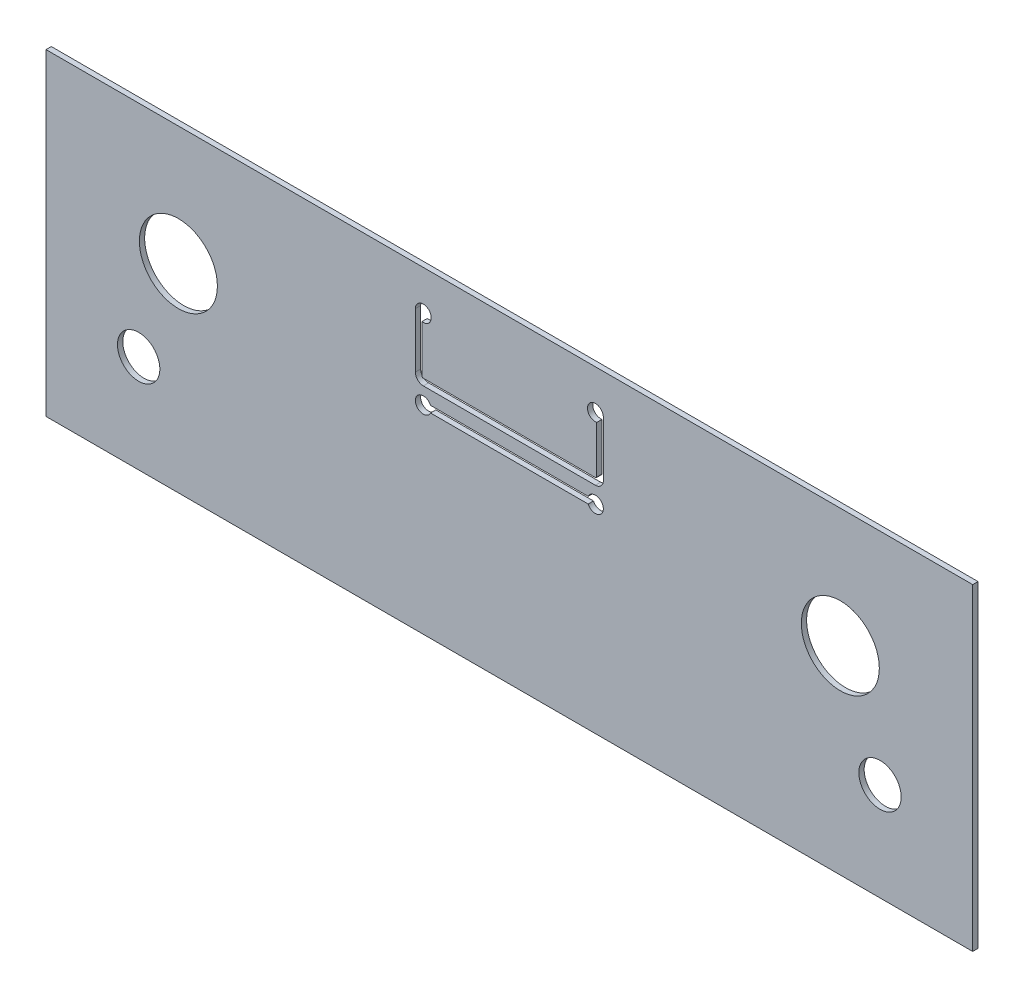
ISO-10303-21;
HEADER;
FILE_DESCRIPTION(('STEP AP214'),'2;1');
FILE_NAME('part.step','',(''),(''),'','','');
FILE_SCHEMA(('AUTOMOTIVE_DESIGN { 1 0 10303 214 1 1 1 1 }'));
ENDSEC;
DATA;
#1=APPLICATION_CONTEXT('core data for automotive mechanical design processes');
#2=APPLICATION_PROTOCOL_DEFINITION('international standard','automotive_design',2000,#1);
#3=PRODUCT_CONTEXT('',#1,'mechanical');
#4=PRODUCT('Part','Part','',(#3));
#5=PRODUCT_RELATED_PRODUCT_CATEGORY('part','',(#4));
#6=PRODUCT_DEFINITION_FORMATION('','',#4);
#7=PRODUCT_DEFINITION_CONTEXT('part definition',#1,'design');
#8=PRODUCT_DEFINITION('design','',#6,#7);
#9=PRODUCT_DEFINITION_SHAPE('','',#8);
#10=(LENGTH_UNIT() NAMED_UNIT(*) SI_UNIT(.MILLI.,.METRE.));
#11=(NAMED_UNIT(*) PLANE_ANGLE_UNIT() SI_UNIT($,.RADIAN.));
#12=(NAMED_UNIT(*) SI_UNIT($,.STERADIAN.) SOLID_ANGLE_UNIT());
#13=UNCERTAINTY_MEASURE_WITH_UNIT(LENGTH_MEASURE(1.E-05),#10,'distance_accuracy_value','');
#14=(GEOMETRIC_REPRESENTATION_CONTEXT(3) GLOBAL_UNCERTAINTY_ASSIGNED_CONTEXT((#13)) GLOBAL_UNIT_ASSIGNED_CONTEXT((#10,
#11,#12)) REPRESENTATION_CONTEXT('',''));
#15=CARTESIAN_POINT('',(0.,0.,0.));
#16=DIRECTION('',(0.,0.,1.));
#17=DIRECTION('',(1.,0.,0.));
#18=AXIS2_PLACEMENT_3D('',#15,#16,#17);
#19=CARTESIAN_POINT('',(0.,0.,0.2));
#20=DIRECTION('',(0.,0.,-1.));
#21=DIRECTION('',(-1.,0.,0.));
#22=AXIS2_PLACEMENT_3D('',#19,#20,#21);
#23=PLANE('',#22);
#24=CARTESIAN_POINT('',(30.,-4.5,0.2));
#25=DIRECTION('',(0.,0.,1.));
#26=DIRECTION('',(1.,0.,0.));
#27=AXIS2_PLACEMENT_3D('',#24,#25,#26);
#28=CIRCLE('',#27,1.4732);
#29=CARTESIAN_POINT('',(31.4732,-4.5,0.2));
#30=VERTEX_POINT('',#29);
#31=EDGE_CURVE('E218',#30,#30,#28,.T.);
#32=ORIENTED_EDGE('',*,*,#31,.F.);
#33=EDGE_LOOP('',(#32));
#34=FACE_BOUND('',#33,.T.);
#35=CARTESIAN_POINT('',(14.25,-4.5,0.2));
#36=DIRECTION('',(0.,0.,1.));
#37=DIRECTION('',(1.,0.,0.));
#38=AXIS2_PLACEMENT_3D('',#35,#36,#37);
#39=CIRCLE('',#38,0.3);
#40=CARTESIAN_POINT('',(14.5227178028659,-4.375,0.2));
#41=VERTEX_POINT('',#40);
#42=CARTESIAN_POINT('',(14.5227178028659,-4.625,0.2));
#43=VERTEX_POINT('',#42);
#44=EDGE_CURVE('E268',#41,#43,#39,.T.);
#45=ORIENTED_EDGE('',*,*,#44,.F.);
#46=DIRECTION('',(-1.,0.,0.));
#47=VECTOR('',#46,1.);
#48=CARTESIAN_POINT('',(20.4772821971341,-4.375,0.2));
#49=LINE('',#48,#47);
#50=CARTESIAN_POINT('',(20.4772821971341,-4.375,0.2));
#51=VERTEX_POINT('',#50);
#52=EDGE_CURVE('E276',#51,#41,#49,.T.);
#53=ORIENTED_EDGE('',*,*,#52,.F.);
#54=CARTESIAN_POINT('',(20.75,-4.5,0.2));
#55=DIRECTION('',(0.,0.,1.));
#56=DIRECTION('',(1.,0.,0.));
#57=AXIS2_PLACEMENT_3D('',#54,#55,#56);
#58=CIRCLE('',#57,0.3);
#59=CARTESIAN_POINT('',(20.4772821971341,-4.625,0.2));
#60=VERTEX_POINT('',#59);
#61=EDGE_CURVE('E273',#60,#51,#58,.T.);
#62=ORIENTED_EDGE('',*,*,#61,.F.);
#63=DIRECTION('',(1.,0.,0.));
#64=VECTOR('',#63,1.);
#65=CARTESIAN_POINT('',(14.5227178028659,-4.625,0.2));
#66=LINE('',#65,#64);
#67=EDGE_CURVE('E270',#43,#60,#66,.T.);
#68=ORIENTED_EDGE('',*,*,#67,.F.);
#69=EDGE_LOOP('',(#45,#53,#62,#68));
#70=FACE_BOUND('',#69,.T.);
#71=CARTESIAN_POINT('',(3.5,-8.3,0.2));
#72=DIRECTION('',(0.,0.,1.));
#73=DIRECTION('',(1.,0.,0.));
#74=AXIS2_PLACEMENT_3D('',#71,#72,#73);
#75=CIRCLE('',#74,0.800099999999999);
#76=CARTESIAN_POINT('',(4.3001,-8.3,0.2));
#77=VERTEX_POINT('',#76);
#78=EDGE_CURVE('E305',#77,#77,#75,.T.);
#79=ORIENTED_EDGE('',*,*,#78,.F.);
#80=EDGE_LOOP('',(#79));
#81=FACE_BOUND('',#80,.T.);
#82=DIRECTION('',(0.,-1.,0.));
#83=VECTOR('',#82,1.);
#84=CARTESIAN_POINT('',(0.,-12.,0.2));
#85=LINE('',#84,#83);
#86=CARTESIAN_POINT('',(0.,0.,0.2));
#87=VERTEX_POINT('',#86);
#88=CARTESIAN_POINT('',(0.,-12.,0.2));
#89=VERTEX_POINT('',#88);
#90=EDGE_CURVE('E311',#87,#89,#85,.T.);
#91=ORIENTED_EDGE('',*,*,#90,.T.);
#92=DIRECTION('',(1.,0.,0.));
#93=VECTOR('',#92,1.);
#94=CARTESIAN_POINT('',(35.,-12.,0.2));
#95=LINE('',#94,#93);
#96=CARTESIAN_POINT('',(35.,-12.,0.2));
#97=VERTEX_POINT('',#96);
#98=EDGE_CURVE('E314',#89,#97,#95,.T.);
#99=ORIENTED_EDGE('',*,*,#98,.T.);
#100=DIRECTION('',(0.,1.,0.));
#101=VECTOR('',#100,1.);
#102=CARTESIAN_POINT('',(35.,0.,0.2));
#103=LINE('',#102,#101);
#104=CARTESIAN_POINT('',(35.,0.,0.2));
#105=VERTEX_POINT('',#104);
#106=EDGE_CURVE('E317',#97,#105,#103,.T.);
#107=ORIENTED_EDGE('',*,*,#106,.T.);
#108=DIRECTION('',(-1.,0.,0.));
#109=VECTOR('',#108,1.);
#110=CARTESIAN_POINT('',(0.,0.,0.2));
#111=LINE('',#110,#109);
#112=EDGE_CURVE('E319',#105,#87,#111,.T.);
#113=ORIENTED_EDGE('',*,*,#112,.T.);
#114=EDGE_LOOP('',(#91,#99,#107,#113));
#115=FACE_BOUND('',#114,.T.);
#116=CARTESIAN_POINT('',(5.,-4.5,0.2));
#117=DIRECTION('',(0.,0.,1.));
#118=DIRECTION('',(1.,0.,0.));
#119=AXIS2_PLACEMENT_3D('',#116,#117,#118);
#120=CIRCLE('',#119,1.4732);
#121=CARTESIAN_POINT('',(6.4732,-4.5,0.2));
#122=VERTEX_POINT('',#121);
#123=EDGE_CURVE('E299',#122,#122,#120,.T.);
#124=ORIENTED_EDGE('',*,*,#123,.F.);
#125=EDGE_LOOP('',(#124));
#126=FACE_BOUND('',#125,.T.);
#127=CARTESIAN_POINT('',(14.25,-3.575,0.2));
#128=DIRECTION('',(0.,0.,-1.));
#129=DIRECTION('',(1.,0.,0.));
#130=AXIS2_PLACEMENT_3D('',#127,#128,#129);
#131=CIRCLE('',#130,0.0499999999999986);
#132=CARTESIAN_POINT('',(14.25,-3.625,0.2));
#133=VERTEX_POINT('',#132);
#134=CARTESIAN_POINT('',(14.2,-3.575,0.2));
#135=VERTEX_POINT('',#134);
#136=EDGE_CURVE('E172',#133,#135,#131,.T.);
#137=ORIENTED_EDGE('',*,*,#136,.F.);
#138=DIRECTION('',(-1.,0.,0.));
#139=VECTOR('',#138,1.);
#140=CARTESIAN_POINT('',(14.25,-3.625,0.2));
#141=LINE('',#140,#139);
#142=CARTESIAN_POINT('',(20.75,-3.625,0.2));
#143=VERTEX_POINT('',#142);
#144=EDGE_CURVE('E215',#143,#133,#141,.T.);
#145=ORIENTED_EDGE('',*,*,#144,.F.);
#146=CARTESIAN_POINT('',(20.75,-3.575,0.2));
#147=DIRECTION('',(0.,0.,-1.));
#148=DIRECTION('',(1.,0.,0.));
#149=AXIS2_PLACEMENT_3D('',#146,#147,#148);
#150=CIRCLE('',#149,0.0499999999999969);
#151=CARTESIAN_POINT('',(20.8,-3.575,0.2));
#152=VERTEX_POINT('',#151);
#153=EDGE_CURVE('E213',#152,#143,#150,.T.);
#154=ORIENTED_EDGE('',*,*,#153,.F.);
#155=DIRECTION('',(0.,-1.,0.));
#156=VECTOR('',#155,1.);
#157=CARTESIAN_POINT('',(20.8,-3.575,0.2));
#158=LINE('',#157,#156);
#159=CARTESIAN_POINT('',(20.8,-1.79580398915498,0.2));
#160=VERTEX_POINT('',#159);
#161=EDGE_CURVE('E211',#160,#152,#158,.T.);
#162=ORIENTED_EDGE('',*,*,#161,.F.);
#163=CARTESIAN_POINT('',(20.75,-1.5,0.2));
#164=DIRECTION('',(0.,0.,1.));
#165=DIRECTION('',(1.,0.,0.));
#166=AXIS2_PLACEMENT_3D('',#163,#164,#165);
#167=CIRCLE('',#166,0.3);
#168=CARTESIAN_POINT('',(21.05,-1.5,0.2));
#169=VERTEX_POINT('',#168);
#170=EDGE_CURVE('E209',#169,#160,#167,.T.);
#171=ORIENTED_EDGE('',*,*,#170,.F.);
#172=DIRECTION('',(0.,1.,0.));
#173=VECTOR('',#172,1.);
#174=CARTESIAN_POINT('',(21.05,-3.575,0.2));
#175=LINE('',#174,#173);
#176=CARTESIAN_POINT('',(21.05,-3.575,0.2));
#177=VERTEX_POINT('',#176);
#178=EDGE_CURVE('E207',#177,#169,#175,.T.);
#179=ORIENTED_EDGE('',*,*,#178,.F.);
#180=CARTESIAN_POINT('',(20.75,-3.575,0.2));
#181=DIRECTION('',(0.,0.,1.));
#182=DIRECTION('',(1.,0.,0.));
#183=AXIS2_PLACEMENT_3D('',#180,#181,#182);
#184=CIRCLE('',#183,0.299999999999999);
#185=CARTESIAN_POINT('',(20.75,-3.875,0.2));
#186=VERTEX_POINT('',#185);
#187=EDGE_CURVE('E205',#186,#177,#184,.T.);
#188=ORIENTED_EDGE('',*,*,#187,.F.);
#189=DIRECTION('',(1.,0.,0.));
#190=VECTOR('',#189,1.);
#191=CARTESIAN_POINT('',(14.25,-3.875,0.2));
#192=LINE('',#191,#190);
#193=CARTESIAN_POINT('',(14.25,-3.875,0.2));
#194=VERTEX_POINT('',#193);
#195=EDGE_CURVE('E203',#194,#186,#192,.T.);
#196=ORIENTED_EDGE('',*,*,#195,.F.);
#197=CARTESIAN_POINT('',(14.25,-3.575,0.2));
#198=DIRECTION('',(0.,0.,1.));
#199=DIRECTION('',(1.,0.,0.));
#200=AXIS2_PLACEMENT_3D('',#197,#198,#199);
#201=CIRCLE('',#200,0.3);
#202=CARTESIAN_POINT('',(13.95,-3.575,0.2));
#203=VERTEX_POINT('',#202);
#204=EDGE_CURVE('E201',#203,#194,#201,.T.);
#205=ORIENTED_EDGE('',*,*,#204,.F.);
#206=DIRECTION('',(0.,-1.,0.));
#207=VECTOR('',#206,1.);
#208=CARTESIAN_POINT('',(13.95,-1.5,0.2));
#209=LINE('',#208,#207);
#210=CARTESIAN_POINT('',(13.95,-1.5,0.2));
#211=VERTEX_POINT('',#210);
#212=EDGE_CURVE('E196',#211,#203,#209,.T.);
#213=ORIENTED_EDGE('',*,*,#212,.F.);
#214=CARTESIAN_POINT('',(14.25,-1.5,0.2));
#215=DIRECTION('',(0.,0.,1.));
#216=DIRECTION('',(1.,0.,0.));
#217=AXIS2_PLACEMENT_3D('',#214,#215,#216);
#218=CIRCLE('',#217,0.3);
#219=CARTESIAN_POINT('',(14.2,-1.79580398915498,0.2));
#220=VERTEX_POINT('',#219);
#221=EDGE_CURVE('E194',#220,#211,#218,.T.);
#222=ORIENTED_EDGE('',*,*,#221,.F.);
#223=DIRECTION('',(0.,1.,0.));
#224=VECTOR('',#223,1.);
#225=CARTESIAN_POINT('',(14.2,-1.79580398915498,0.2));
#226=LINE('',#225,#224);
#227=EDGE_CURVE('E180',#135,#220,#226,.T.);
#228=ORIENTED_EDGE('',*,*,#227,.F.);
#229=EDGE_LOOP('',(#137,#145,#154,#162,#171,#179,#188,#196,#205,#213,#222,#228));
#230=FACE_BOUND('',#229,.T.);
#231=CARTESIAN_POINT('',(31.5,-8.3,0.2));
#232=DIRECTION('',(0.,0.,1.));
#233=DIRECTION('',(1.,0.,0.));
#234=AXIS2_PLACEMENT_3D('',#231,#232,#233);
#235=CIRCLE('',#234,0.800100000000007);
#236=CARTESIAN_POINT('',(32.3001,-8.3,0.2));
#237=VERTEX_POINT('',#236);
#238=EDGE_CURVE('E466',#237,#237,#235,.T.);
#239=ORIENTED_EDGE('',*,*,#238,.F.);
#240=EDGE_LOOP('',(#239));
#241=FACE_BOUND('',#240,.T.);
#242=ADVANCED_FACE('F35',(#34,#70,#81,#115,#126,#230,#241),#23,.F.);
#243=CARTESIAN_POINT('',(0.,0.,0.));
#244=DIRECTION('',(0.,0.,-1.));
#245=DIRECTION('',(-1.,0.,0.));
#246=AXIS2_PLACEMENT_3D('',#243,#244,#245);
#247=PLANE('',#246);
#248=CARTESIAN_POINT('',(30.,-4.5,0.));
#249=DIRECTION('',(0.,0.,1.));
#250=DIRECTION('',(1.,0.,0.));
#251=AXIS2_PLACEMENT_3D('',#248,#249,#250);
#252=CIRCLE('',#251,1.4732);
#253=CARTESIAN_POINT('',(31.4732,-4.5,0.));
#254=VERTEX_POINT('',#253);
#255=EDGE_CURVE('E472',#254,#254,#252,.T.);
#256=ORIENTED_EDGE('',*,*,#255,.T.);
#257=EDGE_LOOP('',(#256));
#258=FACE_BOUND('',#257,.T.);
#259=DIRECTION('',(-1.,0.,0.));
#260=VECTOR('',#259,1.);
#261=CARTESIAN_POINT('',(20.4772821971341,-4.375,0.));
#262=LINE('',#261,#260);
#263=CARTESIAN_POINT('',(20.4772821971341,-4.375,0.));
#264=VERTEX_POINT('',#263);
#265=CARTESIAN_POINT('',(14.5227178028659,-4.375,0.));
#266=VERTEX_POINT('',#265);
#267=EDGE_CURVE('E271',#264,#266,#262,.T.);
#268=ORIENTED_EDGE('',*,*,#267,.T.);
#269=CARTESIAN_POINT('',(14.25,-4.5,0.));
#270=DIRECTION('',(0.,0.,1.));
#271=DIRECTION('',(1.,0.,0.));
#272=AXIS2_PLACEMENT_3D('',#269,#270,#271);
#273=CIRCLE('',#272,0.3);
#274=CARTESIAN_POINT('',(14.5227178028659,-4.625,0.));
#275=VERTEX_POINT('',#274);
#276=EDGE_CURVE('E188',#266,#275,#273,.T.);
#277=ORIENTED_EDGE('',*,*,#276,.T.);
#278=DIRECTION('',(1.,0.,0.));
#279=VECTOR('',#278,1.);
#280=CARTESIAN_POINT('',(14.5227178028659,-4.625,0.));
#281=LINE('',#280,#279);
#282=CARTESIAN_POINT('',(20.4772821971341,-4.625,0.));
#283=VERTEX_POINT('',#282);
#284=EDGE_CURVE('E281',#275,#283,#281,.T.);
#285=ORIENTED_EDGE('',*,*,#284,.T.);
#286=CARTESIAN_POINT('',(20.75,-4.5,0.));
#287=DIRECTION('',(0.,0.,1.));
#288=DIRECTION('',(1.,0.,0.));
#289=AXIS2_PLACEMENT_3D('',#286,#287,#288);
#290=CIRCLE('',#289,0.3);
#291=EDGE_CURVE('E284',#283,#264,#290,.T.);
#292=ORIENTED_EDGE('',*,*,#291,.T.);
#293=EDGE_LOOP('',(#268,#277,#285,#292));
#294=FACE_BOUND('',#293,.T.);
#295=CARTESIAN_POINT('',(3.5,-8.3,0.));
#296=DIRECTION('',(0.,0.,1.));
#297=DIRECTION('',(1.,0.,0.));
#298=AXIS2_PLACEMENT_3D('',#295,#296,#297);
#299=CIRCLE('',#298,0.800099999999999);
#300=CARTESIAN_POINT('',(4.3001,-8.3,0.));
#301=VERTEX_POINT('',#300);
#302=EDGE_CURVE('E302',#301,#301,#299,.T.);
#303=ORIENTED_EDGE('',*,*,#302,.T.);
#304=EDGE_LOOP('',(#303));
#305=FACE_BOUND('',#304,.T.);
#306=DIRECTION('',(0.,-1.,0.));
#307=VECTOR('',#306,1.);
#308=CARTESIAN_POINT('',(0.,-12.,0.));
#309=LINE('',#308,#307);
#310=CARTESIAN_POINT('',(0.,0.,0.));
#311=VERTEX_POINT('',#310);
#312=CARTESIAN_POINT('',(0.,-12.,0.));
#313=VERTEX_POINT('',#312);
#314=EDGE_CURVE('E308',#311,#313,#309,.T.);
#315=ORIENTED_EDGE('',*,*,#314,.F.);
#316=DIRECTION('',(-1.,0.,0.));
#317=VECTOR('',#316,1.);
#318=CARTESIAN_POINT('',(0.,0.,0.));
#319=LINE('',#318,#317);
#320=CARTESIAN_POINT('',(35.,0.,0.));
#321=VERTEX_POINT('',#320);
#322=EDGE_CURVE('E315',#321,#311,#319,.T.);
#323=ORIENTED_EDGE('',*,*,#322,.F.);
#324=DIRECTION('',(0.,1.,0.));
#325=VECTOR('',#324,1.);
#326=CARTESIAN_POINT('',(35.,0.,0.));
#327=LINE('',#326,#325);
#328=CARTESIAN_POINT('',(35.,-12.,0.));
#329=VERTEX_POINT('',#328);
#330=EDGE_CURVE('E326',#329,#321,#327,.T.);
#331=ORIENTED_EDGE('',*,*,#330,.F.);
#332=DIRECTION('',(1.,0.,0.));
#333=VECTOR('',#332,1.);
#334=CARTESIAN_POINT('',(35.,-12.,0.));
#335=LINE('',#334,#333);
#336=EDGE_CURVE('E324',#313,#329,#335,.T.);
#337=ORIENTED_EDGE('',*,*,#336,.F.);
#338=EDGE_LOOP('',(#315,#323,#331,#337));
#339=FACE_BOUND('',#338,.T.);
#340=CARTESIAN_POINT('',(5.,-4.5,0.));
#341=DIRECTION('',(0.,0.,1.));
#342=DIRECTION('',(1.,0.,0.));
#343=AXIS2_PLACEMENT_3D('',#340,#341,#342);
#344=CIRCLE('',#343,1.4732);
#345=CARTESIAN_POINT('',(6.4732,-4.5,0.));
#346=VERTEX_POINT('',#345);
#347=EDGE_CURVE('E298',#346,#346,#344,.T.);
#348=ORIENTED_EDGE('',*,*,#347,.T.);
#349=EDGE_LOOP('',(#348));
#350=FACE_BOUND('',#349,.T.);
#351=DIRECTION('',(-1.,0.,0.));
#352=VECTOR('',#351,1.);
#353=CARTESIAN_POINT('',(14.25,-3.625,0.));
#354=LINE('',#353,#352);
#355=CARTESIAN_POINT('',(20.75,-3.625,0.));
#356=VERTEX_POINT('',#355);
#357=CARTESIAN_POINT('',(14.25,-3.625,0.));
#358=VERTEX_POINT('',#357);
#359=EDGE_CURVE('E181',#356,#358,#354,.T.);
#360=ORIENTED_EDGE('',*,*,#359,.T.);
#361=CARTESIAN_POINT('',(14.25,-3.575,0.));
#362=DIRECTION('',(0.,0.,-1.));
#363=DIRECTION('',(1.,0.,0.));
#364=AXIS2_PLACEMENT_3D('',#361,#362,#363);
#365=CIRCLE('',#364,0.0499999999999986);
#366=CARTESIAN_POINT('',(14.2,-3.575,0.));
#367=VERTEX_POINT('',#366);
#368=EDGE_CURVE('E58',#358,#367,#365,.T.);
#369=ORIENTED_EDGE('',*,*,#368,.T.);
#370=DIRECTION('',(0.,1.,0.));
#371=VECTOR('',#370,1.);
#372=CARTESIAN_POINT('',(14.2,-1.79580398915498,0.));
#373=LINE('',#372,#371);
#374=CARTESIAN_POINT('',(14.2,-1.79580398915498,0.));
#375=VERTEX_POINT('',#374);
#376=EDGE_CURVE('E187',#367,#375,#373,.T.);
#377=ORIENTED_EDGE('',*,*,#376,.T.);
#378=CARTESIAN_POINT('',(14.25,-1.5,0.));
#379=DIRECTION('',(0.,0.,1.));
#380=DIRECTION('',(1.,0.,0.));
#381=AXIS2_PLACEMENT_3D('',#378,#379,#380);
#382=CIRCLE('',#381,0.3);
#383=CARTESIAN_POINT('',(13.95,-1.5,0.));
#384=VERTEX_POINT('',#383);
#385=EDGE_CURVE('E220',#375,#384,#382,.T.);
#386=ORIENTED_EDGE('',*,*,#385,.T.);
#387=DIRECTION('',(0.,-1.,0.));
#388=VECTOR('',#387,1.);
#389=CARTESIAN_POINT('',(13.95,-1.5,0.));
#390=LINE('',#389,#388);
#391=CARTESIAN_POINT('',(13.95,-3.575,0.));
#392=VERTEX_POINT('',#391);
#393=EDGE_CURVE('E223',#384,#392,#390,.T.);
#394=ORIENTED_EDGE('',*,*,#393,.T.);
#395=CARTESIAN_POINT('',(14.25,-3.575,0.));
#396=DIRECTION('',(0.,0.,1.));
#397=DIRECTION('',(1.,0.,0.));
#398=AXIS2_PLACEMENT_3D('',#395,#396,#397);
#399=CIRCLE('',#398,0.3);
#400=CARTESIAN_POINT('',(14.25,-3.875,0.));
#401=VERTEX_POINT('',#400);
#402=EDGE_CURVE('E226',#392,#401,#399,.T.);
#403=ORIENTED_EDGE('',*,*,#402,.T.);
#404=DIRECTION('',(1.,0.,0.));
#405=VECTOR('',#404,1.);
#406=CARTESIAN_POINT('',(14.25,-3.875,0.));
#407=LINE('',#406,#405);
#408=CARTESIAN_POINT('',(20.75,-3.875,0.));
#409=VERTEX_POINT('',#408);
#410=EDGE_CURVE('E229',#401,#409,#407,.T.);
#411=ORIENTED_EDGE('',*,*,#410,.T.);
#412=CARTESIAN_POINT('',(20.75,-3.575,0.));
#413=DIRECTION('',(0.,0.,1.));
#414=DIRECTION('',(1.,0.,0.));
#415=AXIS2_PLACEMENT_3D('',#412,#413,#414);
#416=CIRCLE('',#415,0.299999999999999);
#417=CARTESIAN_POINT('',(21.05,-3.575,0.));
#418=VERTEX_POINT('',#417);
#419=EDGE_CURVE('E232',#409,#418,#416,.T.);
#420=ORIENTED_EDGE('',*,*,#419,.T.);
#421=DIRECTION('',(0.,1.,0.));
#422=VECTOR('',#421,1.);
#423=CARTESIAN_POINT('',(21.05,-3.575,0.));
#424=LINE('',#423,#422);
#425=CARTESIAN_POINT('',(21.05,-1.5,0.));
#426=VERTEX_POINT('',#425);
#427=EDGE_CURVE('E235',#418,#426,#424,.T.);
#428=ORIENTED_EDGE('',*,*,#427,.T.);
#429=CARTESIAN_POINT('',(20.75,-1.5,0.));
#430=DIRECTION('',(0.,0.,1.));
#431=DIRECTION('',(1.,0.,0.));
#432=AXIS2_PLACEMENT_3D('',#429,#430,#431);
#433=CIRCLE('',#432,0.3);
#434=CARTESIAN_POINT('',(20.8,-1.79580398915498,0.));
#435=VERTEX_POINT('',#434);
#436=EDGE_CURVE('E238',#426,#435,#433,.T.);
#437=ORIENTED_EDGE('',*,*,#436,.T.);
#438=DIRECTION('',(0.,-1.,0.));
#439=VECTOR('',#438,1.);
#440=CARTESIAN_POINT('',(20.8,-3.575,0.));
#441=LINE('',#440,#439);
#442=CARTESIAN_POINT('',(20.8,-3.575,0.));
#443=VERTEX_POINT('',#442);
#444=EDGE_CURVE('E241',#435,#443,#441,.T.);
#445=ORIENTED_EDGE('',*,*,#444,.T.);
#446=CARTESIAN_POINT('',(20.75,-3.575,0.));
#447=DIRECTION('',(0.,0.,-1.));
#448=DIRECTION('',(1.,0.,0.));
#449=AXIS2_PLACEMENT_3D('',#446,#447,#448);
#450=CIRCLE('',#449,0.0499999999999969);
#451=EDGE_CURVE('E244',#443,#356,#450,.T.);
#452=ORIENTED_EDGE('',*,*,#451,.T.);
#453=EDGE_LOOP('',(#360,#369,#377,#386,#394,#403,#411,#420,#428,#437,#445,#452));
#454=FACE_BOUND('',#453,.T.);
#455=CARTESIAN_POINT('',(31.5,-8.3,0.));
#456=DIRECTION('',(0.,0.,1.));
#457=DIRECTION('',(1.,0.,0.));
#458=AXIS2_PLACEMENT_3D('',#455,#456,#457);
#459=CIRCLE('',#458,0.800100000000007);
#460=CARTESIAN_POINT('',(32.3001,-8.3,0.));
#461=VERTEX_POINT('',#460);
#462=EDGE_CURVE('E469',#461,#461,#459,.T.);
#463=ORIENTED_EDGE('',*,*,#462,.T.);
#464=EDGE_LOOP('',(#463));
#465=FACE_BOUND('',#464,.T.);
#466=ADVANCED_FACE('F344',(#258,#294,#305,#339,#350,#454,#465),#247,.T.);
#467=CARTESIAN_POINT('',(0.,-12.,0.2));
#468=DIRECTION('',(1.,0.,0.));
#469=DIRECTION('',(0.,0.,-1.));
#470=AXIS2_PLACEMENT_3D('',#467,#468,#469);
#471=PLANE('',#470);
#472=ORIENTED_EDGE('',*,*,#314,.T.);
#473=DIRECTION('',(0.,0.,-1.));
#474=VECTOR('',#473,1.);
#475=CARTESIAN_POINT('',(0.,-12.,0.2));
#476=LINE('',#475,#474);
#477=EDGE_CURVE('E11',#89,#313,#476,.T.);
#478=ORIENTED_EDGE('',*,*,#477,.F.);
#479=ORIENTED_EDGE('',*,*,#90,.F.);
#480=DIRECTION('',(0.,0.,-1.));
#481=VECTOR('',#480,1.);
#482=CARTESIAN_POINT('',(0.,0.,0.2));
#483=LINE('',#482,#481);
#484=EDGE_CURVE('E321',#87,#311,#483,.T.);
#485=ORIENTED_EDGE('',*,*,#484,.T.);
#486=EDGE_LOOP('',(#472,#478,#479,#485));
#487=FACE_BOUND('',#486,.T.);
#488=ADVANCED_FACE('F37',(#487),#471,.F.);
#489=CARTESIAN_POINT('',(35.,-12.,0.2));
#490=DIRECTION('',(0.,1.,0.));
#491=DIRECTION('',(-1.,0.,0.));
#492=AXIS2_PLACEMENT_3D('',#489,#490,#491);
#493=PLANE('',#492);
#494=ORIENTED_EDGE('',*,*,#336,.T.);
#495=DIRECTION('',(0.,0.,-1.));
#496=VECTOR('',#495,1.);
#497=CARTESIAN_POINT('',(35.,-12.,0.2));
#498=LINE('',#497,#496);
#499=EDGE_CURVE('E43',#97,#329,#498,.T.);
#500=ORIENTED_EDGE('',*,*,#499,.F.);
#501=ORIENTED_EDGE('',*,*,#98,.F.);
#502=ORIENTED_EDGE('',*,*,#477,.T.);
#503=EDGE_LOOP('',(#494,#500,#501,#502));
#504=FACE_BOUND('',#503,.T.);
#505=ADVANCED_FACE('F355',(#504),#493,.F.);
#506=CARTESIAN_POINT('',(35.,0.,0.2));
#507=DIRECTION('',(-1.,0.,0.));
#508=DIRECTION('',(0.,-1.,0.));
#509=AXIS2_PLACEMENT_3D('',#506,#507,#508);
#510=PLANE('',#509);
#511=ORIENTED_EDGE('',*,*,#330,.T.);
#512=DIRECTION('',(0.,0.,-1.));
#513=VECTOR('',#512,1.);
#514=CARTESIAN_POINT('',(35.,0.,0.2));
#515=LINE('',#514,#513);
#516=EDGE_CURVE('E331',#105,#321,#515,.T.);
#517=ORIENTED_EDGE('',*,*,#516,.F.);
#518=ORIENTED_EDGE('',*,*,#106,.F.);
#519=ORIENTED_EDGE('',*,*,#499,.T.);
#520=EDGE_LOOP('',(#511,#517,#518,#519));
#521=FACE_BOUND('',#520,.T.);
#522=ADVANCED_FACE('F338',(#521),#510,.F.);
#523=CARTESIAN_POINT('',(0.,0.,0.2));
#524=DIRECTION('',(0.,-1.,0.));
#525=DIRECTION('',(0.,0.,-1.));
#526=AXIS2_PLACEMENT_3D('',#523,#524,#525);
#527=PLANE('',#526);
#528=ORIENTED_EDGE('',*,*,#322,.T.);
#529=ORIENTED_EDGE('',*,*,#484,.F.);
#530=ORIENTED_EDGE('',*,*,#112,.F.);
#531=ORIENTED_EDGE('',*,*,#516,.T.);
#532=EDGE_LOOP('',(#528,#529,#530,#531));
#533=FACE_BOUND('',#532,.T.);
#534=ADVANCED_FACE('F348',(#533),#527,.F.);
#535=CARTESIAN_POINT('',(3.5,-8.3,0.2));
#536=DIRECTION('',(0.,0.,-1.));
#537=DIRECTION('',(-1.,0.,0.));
#538=AXIS2_PLACEMENT_3D('',#535,#536,#537);
#539=CYLINDRICAL_SURFACE('',#538,0.800099999999999);
#540=ORIENTED_EDGE('',*,*,#78,.T.);
#541=EDGE_LOOP('',(#540));
#542=FACE_BOUND('',#541,.T.);
#543=ORIENTED_EDGE('',*,*,#302,.F.);
#544=EDGE_LOOP('',(#543));
#545=FACE_BOUND('',#544,.T.);
#546=ADVANCED_FACE('F373',(#542,#545),#539,.F.);
#547=CARTESIAN_POINT('',(5.,-4.5,0.2));
#548=DIRECTION('',(0.,0.,-1.));
#549=DIRECTION('',(-1.,0.,0.));
#550=AXIS2_PLACEMENT_3D('',#547,#548,#549);
#551=CYLINDRICAL_SURFACE('',#550,1.4732);
#552=ORIENTED_EDGE('',*,*,#123,.T.);
#553=EDGE_LOOP('',(#552));
#554=FACE_BOUND('',#553,.T.);
#555=ORIENTED_EDGE('',*,*,#347,.F.);
#556=EDGE_LOOP('',(#555));
#557=FACE_BOUND('',#556,.T.);
#558=ADVANCED_FACE('F380',(#554,#557),#551,.F.);
#559=CARTESIAN_POINT('',(14.25,-4.5,0.2));
#560=DIRECTION('',(0.,0.,-1.));
#561=DIRECTION('',(-1.,0.,0.));
#562=AXIS2_PLACEMENT_3D('',#559,#560,#561);
#563=CYLINDRICAL_SURFACE('',#562,0.3);
#564=ORIENTED_EDGE('',*,*,#276,.F.);
#565=DIRECTION('',(0.,0.,-1.));
#566=VECTOR('',#565,1.);
#567=CARTESIAN_POINT('',(14.5227178028659,-4.375,0.2));
#568=LINE('',#567,#566);
#569=EDGE_CURVE('E278',#41,#266,#568,.T.);
#570=ORIENTED_EDGE('',*,*,#569,.F.);
#571=ORIENTED_EDGE('',*,*,#44,.T.);
#572=DIRECTION('',(0.,0.,-1.));
#573=VECTOR('',#572,1.);
#574=CARTESIAN_POINT('',(14.5227178028659,-4.625,0.2));
#575=LINE('',#574,#573);
#576=EDGE_CURVE('E295',#43,#275,#575,.T.);
#577=ORIENTED_EDGE('',*,*,#576,.T.);
#578=EDGE_LOOP('',(#564,#570,#571,#577));
#579=FACE_BOUND('',#578,.T.);
#580=ADVANCED_FACE('F385',(#579),#563,.F.);
#581=CARTESIAN_POINT('',(14.5227178028659,-4.625,0.2));
#582=DIRECTION('',(0.,1.,0.));
#583=DIRECTION('',(-1.,0.,0.));
#584=AXIS2_PLACEMENT_3D('',#581,#582,#583);
#585=PLANE('',#584);
#586=ORIENTED_EDGE('',*,*,#284,.F.);
#587=ORIENTED_EDGE('',*,*,#576,.F.);
#588=ORIENTED_EDGE('',*,*,#67,.T.);
#589=DIRECTION('',(0.,0.,-1.));
#590=VECTOR('',#589,1.);
#591=CARTESIAN_POINT('',(20.4772821971341,-4.625,0.2));
#592=LINE('',#591,#590);
#593=EDGE_CURVE('E293',#60,#283,#592,.T.);
#594=ORIENTED_EDGE('',*,*,#593,.T.);
#595=EDGE_LOOP('',(#586,#587,#588,#594));
#596=FACE_BOUND('',#595,.T.);
#597=ADVANCED_FACE('F395',(#596),#585,.T.);
#598=CARTESIAN_POINT('',(20.75,-4.5,0.2));
#599=DIRECTION('',(0.,0.,-1.));
#600=DIRECTION('',(-1.,0.,0.));
#601=AXIS2_PLACEMENT_3D('',#598,#599,#600);
#602=CYLINDRICAL_SURFACE('',#601,0.3);
#603=ORIENTED_EDGE('',*,*,#291,.F.);
#604=ORIENTED_EDGE('',*,*,#593,.F.);
#605=ORIENTED_EDGE('',*,*,#61,.T.);
#606=DIRECTION('',(0.,0.,-1.));
#607=VECTOR('',#606,1.);
#608=CARTESIAN_POINT('',(20.4772821971341,-4.375,0.2));
#609=LINE('',#608,#607);
#610=EDGE_CURVE('E291',#51,#264,#609,.T.);
#611=ORIENTED_EDGE('',*,*,#610,.T.);
#612=EDGE_LOOP('',(#603,#604,#605,#611));
#613=FACE_BOUND('',#612,.T.);
#614=ADVANCED_FACE('F402',(#613),#602,.F.);
#615=CARTESIAN_POINT('',(20.4772821971341,-4.375,0.2));
#616=DIRECTION('',(0.,-1.,0.));
#617=DIRECTION('',(1.,0.,0.));
#618=AXIS2_PLACEMENT_3D('',#615,#616,#617);
#619=PLANE('',#618);
#620=ORIENTED_EDGE('',*,*,#267,.F.);
#621=ORIENTED_EDGE('',*,*,#610,.F.);
#622=ORIENTED_EDGE('',*,*,#52,.T.);
#623=ORIENTED_EDGE('',*,*,#569,.T.);
#624=EDGE_LOOP('',(#620,#621,#622,#623));
#625=FACE_BOUND('',#624,.T.);
#626=ADVANCED_FACE('F406',(#625),#619,.T.);
#627=CARTESIAN_POINT('',(14.25,-3.575,0.2));
#628=DIRECTION('',(0.,0.,-1.));
#629=DIRECTION('',(-1.,0.,0.));
#630=AXIS2_PLACEMENT_3D('',#627,#628,#629);
#631=CYLINDRICAL_SURFACE('',#630,0.0499999999999986);
#632=ORIENTED_EDGE('',*,*,#368,.F.);
#633=DIRECTION('',(0.,0.,-1.));
#634=VECTOR('',#633,1.);
#635=CARTESIAN_POINT('',(14.25,-3.625,0.2));
#636=LINE('',#635,#634);
#637=EDGE_CURVE('E176',#133,#358,#636,.T.);
#638=ORIENTED_EDGE('',*,*,#637,.F.);
#639=ORIENTED_EDGE('',*,*,#136,.T.);
#640=DIRECTION('',(0.,0.,-1.));
#641=VECTOR('',#640,1.);
#642=CARTESIAN_POINT('',(14.2,-3.575,0.2));
#643=LINE('',#642,#641);
#644=EDGE_CURVE('E175',#135,#367,#643,.T.);
#645=ORIENTED_EDGE('',*,*,#644,.T.);
#646=EDGE_LOOP('',(#632,#638,#639,#645));
#647=FACE_BOUND('',#646,.T.);
#648=ADVANCED_FACE('F174',(#647),#631,.T.);
#649=CARTESIAN_POINT('',(14.2,-1.79580398915498,0.2));
#650=DIRECTION('',(-1.,0.,0.));
#651=DIRECTION('',(0.,-1.,0.));
#652=AXIS2_PLACEMENT_3D('',#649,#650,#651);
#653=PLANE('',#652);
#654=ORIENTED_EDGE('',*,*,#376,.F.);
#655=ORIENTED_EDGE('',*,*,#644,.F.);
#656=ORIENTED_EDGE('',*,*,#227,.T.);
#657=DIRECTION('',(0.,0.,-1.));
#658=VECTOR('',#657,1.);
#659=CARTESIAN_POINT('',(14.2,-1.79580398915498,0.2));
#660=LINE('',#659,#658);
#661=EDGE_CURVE('E189',#220,#375,#660,.T.);
#662=ORIENTED_EDGE('',*,*,#661,.T.);
#663=EDGE_LOOP('',(#654,#655,#656,#662));
#664=FACE_BOUND('',#663,.T.);
#665=ADVANCED_FACE('F184',(#664),#653,.T.);
#666=CARTESIAN_POINT('',(14.25,-1.5,0.2));
#667=DIRECTION('',(0.,0.,-1.));
#668=DIRECTION('',(-1.,0.,0.));
#669=AXIS2_PLACEMENT_3D('',#666,#667,#668);
#670=CYLINDRICAL_SURFACE('',#669,0.3);
#671=ORIENTED_EDGE('',*,*,#385,.F.);
#672=ORIENTED_EDGE('',*,*,#661,.F.);
#673=ORIENTED_EDGE('',*,*,#221,.T.);
#674=DIRECTION('',(0.,0.,-1.));
#675=VECTOR('',#674,1.);
#676=CARTESIAN_POINT('',(13.95,-1.5,0.2));
#677=LINE('',#676,#675);
#678=EDGE_CURVE('E265',#211,#384,#677,.T.);
#679=ORIENTED_EDGE('',*,*,#678,.T.);
#680=EDGE_LOOP('',(#671,#672,#673,#679));
#681=FACE_BOUND('',#680,.T.);
#682=ADVANCED_FACE('F415',(#681),#670,.F.);
#683=CARTESIAN_POINT('',(13.95,-1.5,0.2));
#684=DIRECTION('',(1.,0.,0.));
#685=DIRECTION('',(0.,1.,0.));
#686=AXIS2_PLACEMENT_3D('',#683,#684,#685);
#687=PLANE('',#686);
#688=ORIENTED_EDGE('',*,*,#393,.F.);
#689=ORIENTED_EDGE('',*,*,#678,.F.);
#690=ORIENTED_EDGE('',*,*,#212,.T.);
#691=DIRECTION('',(0.,0.,-1.));
#692=VECTOR('',#691,1.);
#693=CARTESIAN_POINT('',(13.95,-3.575,0.2));
#694=LINE('',#693,#692);
#695=EDGE_CURVE('E263',#203,#392,#694,.T.);
#696=ORIENTED_EDGE('',*,*,#695,.T.);
#697=EDGE_LOOP('',(#688,#689,#690,#696));
#698=FACE_BOUND('',#697,.T.);
#699=ADVANCED_FACE('F418',(#698),#687,.T.);
#700=CARTESIAN_POINT('',(14.25,-3.575,0.2));
#701=DIRECTION('',(0.,0.,-1.));
#702=DIRECTION('',(-1.,0.,0.));
#703=AXIS2_PLACEMENT_3D('',#700,#701,#702);
#704=CYLINDRICAL_SURFACE('',#703,0.3);
#705=ORIENTED_EDGE('',*,*,#402,.F.);
#706=ORIENTED_EDGE('',*,*,#695,.F.);
#707=ORIENTED_EDGE('',*,*,#204,.T.);
#708=DIRECTION('',(0.,0.,-1.));
#709=VECTOR('',#708,1.);
#710=CARTESIAN_POINT('',(14.25,-3.875,0.2));
#711=LINE('',#710,#709);
#712=EDGE_CURVE('E261',#194,#401,#711,.T.);
#713=ORIENTED_EDGE('',*,*,#712,.T.);
#714=EDGE_LOOP('',(#705,#706,#707,#713));
#715=FACE_BOUND('',#714,.T.);
#716=ADVANCED_FACE('F422',(#715),#704,.F.);
#717=CARTESIAN_POINT('',(14.25,-3.875,0.2));
#718=DIRECTION('',(0.,1.,0.));
#719=DIRECTION('',(-1.,0.,0.));
#720=AXIS2_PLACEMENT_3D('',#717,#718,#719);
#721=PLANE('',#720);
#722=ORIENTED_EDGE('',*,*,#410,.F.);
#723=ORIENTED_EDGE('',*,*,#712,.F.);
#724=ORIENTED_EDGE('',*,*,#195,.T.);
#725=DIRECTION('',(0.,0.,-1.));
#726=VECTOR('',#725,1.);
#727=CARTESIAN_POINT('',(20.75,-3.875,0.2));
#728=LINE('',#727,#726);
#729=EDGE_CURVE('E259',#186,#409,#728,.T.);
#730=ORIENTED_EDGE('',*,*,#729,.T.);
#731=EDGE_LOOP('',(#722,#723,#724,#730));
#732=FACE_BOUND('',#731,.T.);
#733=ADVANCED_FACE('F426',(#732),#721,.T.);
#734=CARTESIAN_POINT('',(20.75,-3.575,0.2));
#735=DIRECTION('',(0.,0.,-1.));
#736=DIRECTION('',(-1.,0.,0.));
#737=AXIS2_PLACEMENT_3D('',#734,#735,#736);
#738=CYLINDRICAL_SURFACE('',#737,0.299999999999999);
#739=ORIENTED_EDGE('',*,*,#419,.F.);
#740=ORIENTED_EDGE('',*,*,#729,.F.);
#741=ORIENTED_EDGE('',*,*,#187,.T.);
#742=DIRECTION('',(0.,0.,-1.));
#743=VECTOR('',#742,1.);
#744=CARTESIAN_POINT('',(21.05,-3.575,0.2));
#745=LINE('',#744,#743);
#746=EDGE_CURVE('E257',#177,#418,#745,.T.);
#747=ORIENTED_EDGE('',*,*,#746,.T.);
#748=EDGE_LOOP('',(#739,#740,#741,#747));
#749=FACE_BOUND('',#748,.T.);
#750=ADVANCED_FACE('F430',(#749),#738,.F.);
#751=CARTESIAN_POINT('',(21.05,-3.575,0.2));
#752=DIRECTION('',(-1.,0.,0.));
#753=DIRECTION('',(0.,-1.,0.));
#754=AXIS2_PLACEMENT_3D('',#751,#752,#753);
#755=PLANE('',#754);
#756=ORIENTED_EDGE('',*,*,#427,.F.);
#757=ORIENTED_EDGE('',*,*,#746,.F.);
#758=ORIENTED_EDGE('',*,*,#178,.T.);
#759=DIRECTION('',(0.,0.,-1.));
#760=VECTOR('',#759,1.);
#761=CARTESIAN_POINT('',(21.05,-1.5,0.2));
#762=LINE('',#761,#760);
#763=EDGE_CURVE('E255',#169,#426,#762,.T.);
#764=ORIENTED_EDGE('',*,*,#763,.T.);
#765=EDGE_LOOP('',(#756,#757,#758,#764));
#766=FACE_BOUND('',#765,.T.);
#767=ADVANCED_FACE('F434',(#766),#755,.T.);
#768=CARTESIAN_POINT('',(20.75,-1.5,0.2));
#769=DIRECTION('',(0.,0.,-1.));
#770=DIRECTION('',(-1.,0.,0.));
#771=AXIS2_PLACEMENT_3D('',#768,#769,#770);
#772=CYLINDRICAL_SURFACE('',#771,0.3);
#773=ORIENTED_EDGE('',*,*,#436,.F.);
#774=ORIENTED_EDGE('',*,*,#763,.F.);
#775=ORIENTED_EDGE('',*,*,#170,.T.);
#776=DIRECTION('',(0.,0.,-1.));
#777=VECTOR('',#776,1.);
#778=CARTESIAN_POINT('',(20.8,-1.79580398915498,0.2));
#779=LINE('',#778,#777);
#780=EDGE_CURVE('E253',#160,#435,#779,.T.);
#781=ORIENTED_EDGE('',*,*,#780,.T.);
#782=EDGE_LOOP('',(#773,#774,#775,#781));
#783=FACE_BOUND('',#782,.T.);
#784=ADVANCED_FACE('F438',(#783),#772,.F.);
#785=CARTESIAN_POINT('',(20.8,-3.575,0.2));
#786=DIRECTION('',(1.,0.,0.));
#787=DIRECTION('',(0.,1.,0.));
#788=AXIS2_PLACEMENT_3D('',#785,#786,#787);
#789=PLANE('',#788);
#790=ORIENTED_EDGE('',*,*,#444,.F.);
#791=ORIENTED_EDGE('',*,*,#780,.F.);
#792=ORIENTED_EDGE('',*,*,#161,.T.);
#793=DIRECTION('',(0.,0.,-1.));
#794=VECTOR('',#793,1.);
#795=CARTESIAN_POINT('',(20.8,-3.575,0.2));
#796=LINE('',#795,#794);
#797=EDGE_CURVE('E251',#152,#443,#796,.T.);
#798=ORIENTED_EDGE('',*,*,#797,.T.);
#799=EDGE_LOOP('',(#790,#791,#792,#798));
#800=FACE_BOUND('',#799,.T.);
#801=ADVANCED_FACE('F442',(#800),#789,.T.);
#802=CARTESIAN_POINT('',(20.75,-3.575,0.2));
#803=DIRECTION('',(0.,0.,-1.));
#804=DIRECTION('',(-1.,0.,0.));
#805=AXIS2_PLACEMENT_3D('',#802,#803,#804);
#806=CYLINDRICAL_SURFACE('',#805,0.0499999999999969);
#807=ORIENTED_EDGE('',*,*,#451,.F.);
#808=ORIENTED_EDGE('',*,*,#797,.F.);
#809=ORIENTED_EDGE('',*,*,#153,.T.);
#810=DIRECTION('',(0.,0.,-1.));
#811=VECTOR('',#810,1.);
#812=CARTESIAN_POINT('',(20.75,-3.625,0.2));
#813=LINE('',#812,#811);
#814=EDGE_CURVE('E50',#143,#356,#813,.T.);
#815=ORIENTED_EDGE('',*,*,#814,.T.);
#816=EDGE_LOOP('',(#807,#808,#809,#815));
#817=FACE_BOUND('',#816,.T.);
#818=ADVANCED_FACE('F446',(#817),#806,.T.);
#819=CARTESIAN_POINT('',(14.25,-3.625,0.2));
#820=DIRECTION('',(0.,-1.,0.));
#821=DIRECTION('',(1.,0.,0.));
#822=AXIS2_PLACEMENT_3D('',#819,#820,#821);
#823=PLANE('',#822);
#824=ORIENTED_EDGE('',*,*,#359,.F.);
#825=ORIENTED_EDGE('',*,*,#814,.F.);
#826=ORIENTED_EDGE('',*,*,#144,.T.);
#827=ORIENTED_EDGE('',*,*,#637,.T.);
#828=EDGE_LOOP('',(#824,#825,#826,#827));
#829=FACE_BOUND('',#828,.T.);
#830=ADVANCED_FACE('F450',(#829),#823,.T.);
#831=CARTESIAN_POINT('',(30.,-4.5,0.2));
#832=DIRECTION('',(0.,0.,-1.));
#833=DIRECTION('',(-1.,0.,0.));
#834=AXIS2_PLACEMENT_3D('',#831,#832,#833);
#835=CYLINDRICAL_SURFACE('',#834,1.4732);
#836=ORIENTED_EDGE('',*,*,#31,.T.);
#837=EDGE_LOOP('',(#836));
#838=FACE_BOUND('',#837,.T.);
#839=ORIENTED_EDGE('',*,*,#255,.F.);
#840=EDGE_LOOP('',(#839));
#841=FACE_BOUND('',#840,.T.);
#842=ADVANCED_FACE('F454',(#838,#841),#835,.F.);
#843=CARTESIAN_POINT('',(31.5,-8.3,0.2));
#844=DIRECTION('',(0.,0.,-1.));
#845=DIRECTION('',(-1.,0.,0.));
#846=AXIS2_PLACEMENT_3D('',#843,#844,#845);
#847=CYLINDRICAL_SURFACE('',#846,0.800100000000007);
#848=ORIENTED_EDGE('',*,*,#238,.T.);
#849=EDGE_LOOP('',(#848));
#850=FACE_BOUND('',#849,.T.);
#851=ORIENTED_EDGE('',*,*,#462,.F.);
#852=EDGE_LOOP('',(#851));
#853=FACE_BOUND('',#852,.T.);
#854=ADVANCED_FACE('F457',(#850,#853),#847,.F.);
#855=CLOSED_SHELL('',(#242,#466,#488,#505,#522,#534,#546,#558,#580,#597,#614,#626,#648,#665,
#682,#699,#716,#733,#750,#767,#784,#801,#818,#830,#842,#854));
#856=MANIFOLD_SOLID_BREP('B2',#855);
#857=ADVANCED_BREP_SHAPE_REPRESENTATION('',(#18,#856),#14);
#858=SHAPE_DEFINITION_REPRESENTATION(#9,#857);
ENDSEC;
END-ISO-10303-21;
